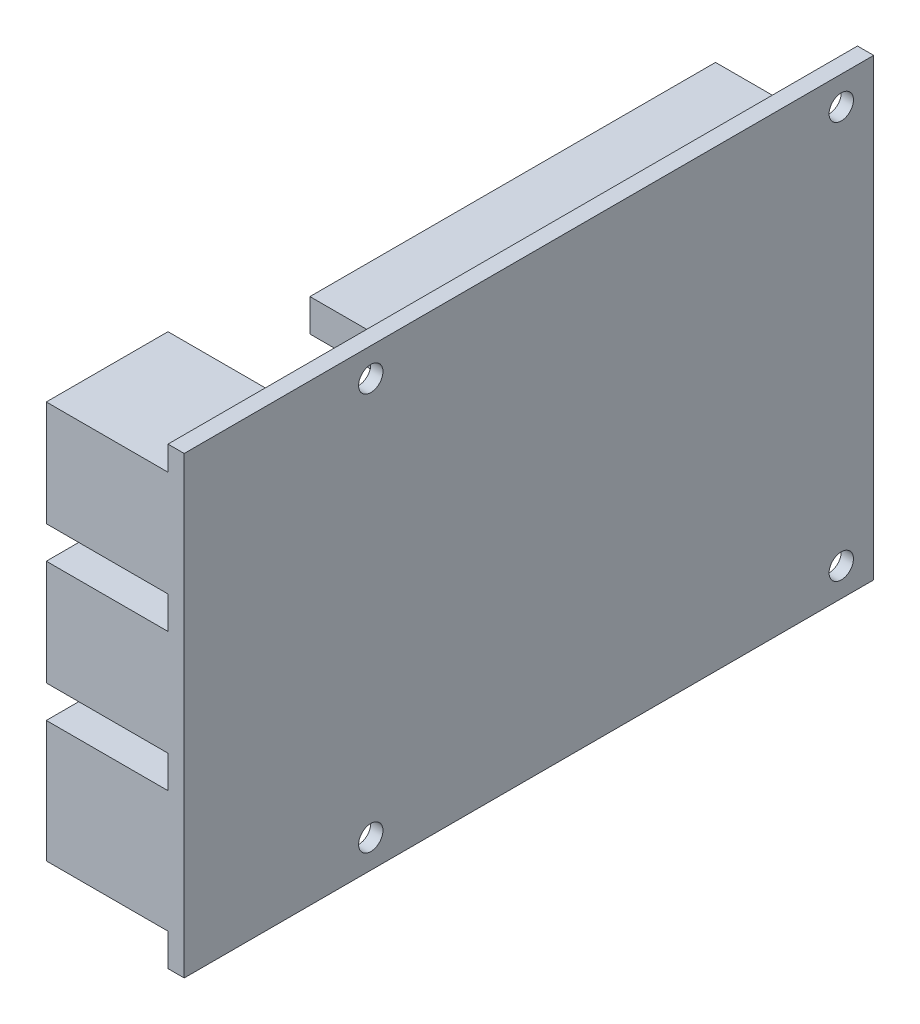
ISO-10303-21;
HEADER;
FILE_DESCRIPTION(('STEP AP214'),'2;1');
FILE_NAME('part.step','',(''),(''),'','','');
FILE_SCHEMA(('AUTOMOTIVE_DESIGN { 1 0 10303 214 1 1 1 1 }'));
ENDSEC;
DATA;
#1=APPLICATION_CONTEXT('core data for automotive mechanical design processes');
#2=APPLICATION_PROTOCOL_DEFINITION('international standard','automotive_design',2000,#1);
#3=PRODUCT_CONTEXT('',#1,'mechanical');
#4=PRODUCT('Part','Part','',(#3));
#5=PRODUCT_RELATED_PRODUCT_CATEGORY('part','',(#4));
#6=PRODUCT_DEFINITION_FORMATION('','',#4);
#7=PRODUCT_DEFINITION_CONTEXT('part definition',#1,'design');
#8=PRODUCT_DEFINITION('design','',#6,#7);
#9=PRODUCT_DEFINITION_SHAPE('','',#8);
#10=(LENGTH_UNIT() NAMED_UNIT(*) SI_UNIT(.MILLI.,.METRE.));
#11=(NAMED_UNIT(*) PLANE_ANGLE_UNIT() SI_UNIT($,.RADIAN.));
#12=(NAMED_UNIT(*) SI_UNIT($,.STERADIAN.) SOLID_ANGLE_UNIT());
#13=UNCERTAINTY_MEASURE_WITH_UNIT(LENGTH_MEASURE(1.E-05),#10,'distance_accuracy_value','');
#14=(GEOMETRIC_REPRESENTATION_CONTEXT(3) GLOBAL_UNCERTAINTY_ASSIGNED_CONTEXT((#13)) GLOBAL_UNIT_ASSIGNED_CONTEXT((#10,
#11,#12)) REPRESENTATION_CONTEXT('',''));
#15=CARTESIAN_POINT('',(0.,0.,0.));
#16=DIRECTION('',(0.,0.,1.));
#17=DIRECTION('',(1.,0.,0.));
#18=AXIS2_PLACEMENT_3D('',#15,#16,#17);
#19=CARTESIAN_POINT('',(0.,0.,0.));
#20=DIRECTION('',(-1.,0.,0.));
#21=DIRECTION('',(0.,0.,1.));
#22=AXIS2_PLACEMENT_3D('',#19,#20,#21);
#23=PLANE('',#22);
#24=CARTESIAN_POINT('',(0.,-24.5,19.5));
#25=DIRECTION('',(-1.,0.,0.));
#26=DIRECTION('',(0.,0.,-1.));
#27=AXIS2_PLACEMENT_3D('',#24,#25,#26);
#28=CIRCLE('',#27,2.5);
#29=CARTESIAN_POINT('',(0.,-24.5,17.));
#30=VERTEX_POINT('',#29);
#31=EDGE_CURVE('E201',#30,#30,#28,.T.);
#32=ORIENTED_EDGE('',*,*,#31,.F.);
#33=EDGE_LOOP('',(#32));
#34=FACE_BOUND('',#33,.T.);
#35=CARTESIAN_POINT('',(0.,-24.5,-38.5));
#36=DIRECTION('',(-1.,0.,0.));
#37=DIRECTION('',(0.,0.,-1.));
#38=AXIS2_PLACEMENT_3D('',#35,#36,#37);
#39=CIRCLE('',#38,2.5);
#40=CARTESIAN_POINT('',(0.,-24.5,-41.));
#41=VERTEX_POINT('',#40);
#42=EDGE_CURVE('E219',#41,#41,#39,.T.);
#43=ORIENTED_EDGE('',*,*,#42,.F.);
#44=EDGE_LOOP('',(#43));
#45=FACE_BOUND('',#44,.T.);
#46=CARTESIAN_POINT('',(0.,24.5,-38.5));
#47=DIRECTION('',(-1.,0.,0.));
#48=DIRECTION('',(0.,0.,1.));
#49=AXIS2_PLACEMENT_3D('',#46,#47,#48);
#50=CIRCLE('',#49,2.5);
#51=CARTESIAN_POINT('',(0.,24.5,-36.));
#52=VERTEX_POINT('',#51);
#53=EDGE_CURVE('E213',#52,#52,#50,.T.);
#54=ORIENTED_EDGE('',*,*,#53,.F.);
#55=EDGE_LOOP('',(#54));
#56=FACE_BOUND('',#55,.T.);
#57=CARTESIAN_POINT('',(0.,24.5,19.5));
#58=DIRECTION('',(-1.,0.,0.));
#59=DIRECTION('',(0.,0.,1.));
#60=AXIS2_PLACEMENT_3D('',#57,#58,#59);
#61=CIRCLE('',#60,2.5);
#62=CARTESIAN_POINT('',(0.,24.5,22.));
#63=VERTEX_POINT('',#62);
#64=EDGE_CURVE('E212',#63,#63,#61,.T.);
#65=ORIENTED_EDGE('',*,*,#64,.F.);
#66=EDGE_LOOP('',(#65));
#67=FACE_BOUND('',#66,.T.);
#68=DIRECTION('',(0.,1.,0.));
#69=VECTOR('',#68,1.);
#70=CARTESIAN_POINT('',(0.,12.,27.5));
#71=LINE('',#70,#69);
#72=CARTESIAN_POINT('',(0.,12.,27.5));
#73=VERTEX_POINT('',#72);
#74=CARTESIAN_POINT('',(0.,25.,27.5));
#75=VERTEX_POINT('',#74);
#76=EDGE_CURVE('E241',#73,#75,#71,.T.);
#77=ORIENTED_EDGE('',*,*,#76,.T.);
#78=DIRECTION('',(0.,0.,-1.));
#79=VECTOR('',#78,1.);
#80=CARTESIAN_POINT('',(0.,25.,42.5));
#81=LINE('',#80,#79);
#82=CARTESIAN_POINT('',(0.,25.,42.5));
#83=VERTEX_POINT('',#82);
#84=EDGE_CURVE('E245',#83,#75,#81,.T.);
#85=ORIENTED_EDGE('',*,*,#84,.F.);
#86=DIRECTION('',(0.,-1.,0.));
#87=VECTOR('',#86,1.);
#88=CARTESIAN_POINT('',(0.,-28.,42.5));
#89=LINE('',#88,#87);
#90=CARTESIAN_POINT('',(0.,28.,42.5));
#91=VERTEX_POINT('',#90);
#92=EDGE_CURVE('E330',#91,#83,#89,.T.);
#93=ORIENTED_EDGE('',*,*,#92,.F.);
#94=DIRECTION('',(0.,0.,1.));
#95=VECTOR('',#94,1.);
#96=CARTESIAN_POINT('',(0.,28.,42.5));
#97=LINE('',#96,#95);
#98=CARTESIAN_POINT('',(0.,28.,-42.5));
#99=VERTEX_POINT('',#98);
#100=EDGE_CURVE('E327',#99,#91,#97,.T.);
#101=ORIENTED_EDGE('',*,*,#100,.F.);
#102=DIRECTION('',(0.,1.,0.));
#103=VECTOR('',#102,1.);
#104=CARTESIAN_POINT('',(0.,-28.,-42.5));
#105=LINE('',#104,#103);
#106=CARTESIAN_POINT('',(0.,-28.,-42.5));
#107=VERTEX_POINT('',#106);
#108=EDGE_CURVE('E313',#107,#99,#105,.T.);
#109=ORIENTED_EDGE('',*,*,#108,.F.);
#110=DIRECTION('',(0.,0.,-1.));
#111=VECTOR('',#110,1.);
#112=CARTESIAN_POINT('',(0.,-28.,42.5));
#113=LINE('',#112,#111);
#114=CARTESIAN_POINT('',(0.,-28.,42.5));
#115=VERTEX_POINT('',#114);
#116=EDGE_CURVE('E318',#115,#107,#113,.T.);
#117=ORIENTED_EDGE('',*,*,#116,.F.);
#118=CARTESIAN_POINT('',(0.,-24.,42.5));
#119=VERTEX_POINT('',#118);
#120=EDGE_CURVE('E329',#119,#115,#89,.T.);
#121=ORIENTED_EDGE('',*,*,#120,.F.);
#122=DIRECTION('',(0.,0.,-1.));
#123=VECTOR('',#122,1.);
#124=CARTESIAN_POINT('',(0.,-24.,42.5));
#125=LINE('',#124,#123);
#126=CARTESIAN_POINT('',(0.,-24.,22.5));
#127=VERTEX_POINT('',#126);
#128=EDGE_CURVE('E289',#119,#127,#125,.T.);
#129=ORIENTED_EDGE('',*,*,#128,.T.);
#130=DIRECTION('',(0.,1.,0.));
#131=VECTOR('',#130,1.);
#132=CARTESIAN_POINT('',(0.,-24.,22.5));
#133=LINE('',#132,#131);
#134=CARTESIAN_POINT('',(0.,-8.99999999999999,22.5));
#135=VERTEX_POINT('',#134);
#136=EDGE_CURVE('E299',#127,#135,#133,.T.);
#137=ORIENTED_EDGE('',*,*,#136,.T.);
#138=DIRECTION('',(0.,0.,-1.));
#139=VECTOR('',#138,1.);
#140=CARTESIAN_POINT('',(0.,-8.99999999999999,42.5));
#141=LINE('',#140,#139);
#142=CARTESIAN_POINT('',(0.,-8.99999999999999,42.5));
#143=VERTEX_POINT('',#142);
#144=EDGE_CURVE('E277',#143,#135,#141,.T.);
#145=ORIENTED_EDGE('',*,*,#144,.F.);
#146=CARTESIAN_POINT('',(0.,-4.99999999999999,42.5));
#147=VERTEX_POINT('',#146);
#148=EDGE_CURVE('E468',#147,#143,#89,.T.);
#149=ORIENTED_EDGE('',*,*,#148,.F.);
#150=DIRECTION('',(0.,0.,-1.));
#151=VECTOR('',#150,1.);
#152=CARTESIAN_POINT('',(0.,-4.99999999999999,42.5));
#153=LINE('',#152,#151);
#154=CARTESIAN_POINT('',(0.,-4.99999999999999,27.5));
#155=VERTEX_POINT('',#154);
#156=EDGE_CURVE('E267',#147,#155,#153,.T.);
#157=ORIENTED_EDGE('',*,*,#156,.T.);
#158=DIRECTION('',(0.,1.,0.));
#159=VECTOR('',#158,1.);
#160=CARTESIAN_POINT('',(0.,-4.99999999999999,27.5));
#161=LINE('',#160,#159);
#162=CARTESIAN_POINT('',(0.,8.00000000000001,27.5));
#163=VERTEX_POINT('',#162);
#164=EDGE_CURVE('E270',#155,#163,#161,.T.);
#165=ORIENTED_EDGE('',*,*,#164,.T.);
#166=DIRECTION('',(0.,0.,-1.));
#167=VECTOR('',#166,1.);
#168=CARTESIAN_POINT('',(0.,8.00000000000001,42.5));
#169=LINE('',#168,#167);
#170=CARTESIAN_POINT('',(0.,8.00000000000001,42.5));
#171=VERTEX_POINT('',#170);
#172=EDGE_CURVE('E274',#171,#163,#169,.T.);
#173=ORIENTED_EDGE('',*,*,#172,.F.);
#174=CARTESIAN_POINT('',(0.,12.,42.5));
#175=VERTEX_POINT('',#174);
#176=EDGE_CURVE('E333',#175,#171,#89,.T.);
#177=ORIENTED_EDGE('',*,*,#176,.F.);
#178=DIRECTION('',(0.,0.,-1.));
#179=VECTOR('',#178,1.);
#180=CARTESIAN_POINT('',(0.,12.,42.5));
#181=LINE('',#180,#179);
#182=EDGE_CURVE('E62',#175,#73,#181,.T.);
#183=ORIENTED_EDGE('',*,*,#182,.T.);
#184=EDGE_LOOP('',(#77,#85,#93,#101,#109,#117,#121,#129,#137,#145,#149,#157,#165,#173,#177,#183));
#185=FACE_BOUND('',#184,.T.);
#186=DIRECTION('',(0.,0.,-1.));
#187=VECTOR('',#186,1.);
#188=CARTESIAN_POINT('',(0.,26.,16.));
#189=LINE('',#188,#187);
#190=CARTESIAN_POINT('',(0.,26.,16.));
#191=VERTEX_POINT('',#190);
#192=CARTESIAN_POINT('',(0.,26.,-34.));
#193=VERTEX_POINT('',#192);
#194=EDGE_CURVE('E492',#191,#193,#189,.T.);
#195=ORIENTED_EDGE('',*,*,#194,.F.);
#196=DIRECTION('',(0.,1.,0.));
#197=VECTOR('',#196,1.);
#198=CARTESIAN_POINT('',(0.,22.,16.));
#199=LINE('',#198,#197);
#200=CARTESIAN_POINT('',(0.,22.,16.));
#201=VERTEX_POINT('',#200);
#202=EDGE_CURVE('E199',#201,#191,#199,.T.);
#203=ORIENTED_EDGE('',*,*,#202,.F.);
#204=DIRECTION('',(0.,0.,1.));
#205=VECTOR('',#204,1.);
#206=CARTESIAN_POINT('',(0.,22.,16.));
#207=LINE('',#206,#205);
#208=CARTESIAN_POINT('',(0.,22.,-34.));
#209=VERTEX_POINT('',#208);
#210=EDGE_CURVE('E195',#209,#201,#207,.T.);
#211=ORIENTED_EDGE('',*,*,#210,.F.);
#212=DIRECTION('',(0.,-1.,0.));
#213=VECTOR('',#212,1.);
#214=CARTESIAN_POINT('',(0.,22.,-34.));
#215=LINE('',#214,#213);
#216=EDGE_CURVE('E494',#193,#209,#215,.T.);
#217=ORIENTED_EDGE('',*,*,#216,.F.);
#218=EDGE_LOOP('',(#195,#203,#211,#217));
#219=FACE_BOUND('',#218,.T.);
#220=ADVANCED_FACE('F37',(#34,#45,#56,#67,#185,#219),#23,.T.);
#221=CARTESIAN_POINT('',(15.,24.5,-38.5));
#222=DIRECTION('',(-1.,0.,0.));
#223=DIRECTION('',(0.,0.,1.));
#224=AXIS2_PLACEMENT_3D('',#221,#222,#223);
#225=CYLINDRICAL_SURFACE('',#224,1.5);
#226=CARTESIAN_POINT('',(2.,24.5,-38.5));
#227=DIRECTION('',(-1.,0.,0.));
#228=DIRECTION('',(0.,0.,1.));
#229=AXIS2_PLACEMENT_3D('',#226,#227,#228);
#230=CIRCLE('',#229,1.5);
#231=CARTESIAN_POINT('',(2.,24.5,-37.));
#232=VERTEX_POINT('',#231);
#233=EDGE_CURVE('E342',#232,#232,#230,.T.);
#234=ORIENTED_EDGE('',*,*,#233,.F.);
#235=EDGE_LOOP('',(#234));
#236=FACE_BOUND('',#235,.T.);
#237=CARTESIAN_POINT('',(0.5,24.5,-38.5));
#238=DIRECTION('',(-1.,0.,0.));
#239=DIRECTION('',(0.,0.,1.));
#240=AXIS2_PLACEMENT_3D('',#237,#238,#239);
#241=CIRCLE('',#240,1.5);
#242=CARTESIAN_POINT('',(0.5,24.5,-37.));
#243=VERTEX_POINT('',#242);
#244=EDGE_CURVE('E41',#243,#243,#241,.F.);
#245=ORIENTED_EDGE('',*,*,#244,.F.);
#246=EDGE_LOOP('',(#245));
#247=FACE_BOUND('',#246,.T.);
#248=ADVANCED_FACE('F366',(#236,#247),#225,.F.);
#249=CARTESIAN_POINT('',(15.,24.5,19.5));
#250=DIRECTION('',(-1.,0.,0.));
#251=DIRECTION('',(0.,0.,1.));
#252=AXIS2_PLACEMENT_3D('',#249,#250,#251);
#253=CYLINDRICAL_SURFACE('',#252,1.5);
#254=CARTESIAN_POINT('',(2.,24.5,19.5));
#255=DIRECTION('',(-1.,0.,0.));
#256=DIRECTION('',(0.,0.,1.));
#257=AXIS2_PLACEMENT_3D('',#254,#255,#256);
#258=CIRCLE('',#257,1.5);
#259=CARTESIAN_POINT('',(2.,24.5,21.));
#260=VERTEX_POINT('',#259);
#261=EDGE_CURVE('E233',#260,#260,#258,.T.);
#262=ORIENTED_EDGE('',*,*,#261,.F.);
#263=EDGE_LOOP('',(#262));
#264=FACE_BOUND('',#263,.T.);
#265=CARTESIAN_POINT('',(0.5,24.5,19.5));
#266=DIRECTION('',(-1.,0.,0.));
#267=DIRECTION('',(0.,0.,1.));
#268=AXIS2_PLACEMENT_3D('',#265,#266,#267);
#269=CIRCLE('',#268,1.5);
#270=CARTESIAN_POINT('',(0.5,24.5,21.));
#271=VERTEX_POINT('',#270);
#272=EDGE_CURVE('E227',#271,#271,#269,.F.);
#273=ORIENTED_EDGE('',*,*,#272,.F.);
#274=EDGE_LOOP('',(#273));
#275=FACE_BOUND('',#274,.T.);
#276=ADVANCED_FACE('F368',(#264,#275),#253,.F.);
#277=CARTESIAN_POINT('',(2.,-28.,-42.5));
#278=DIRECTION('',(0.,0.,1.));
#279=DIRECTION('',(1.,0.,0.));
#280=AXIS2_PLACEMENT_3D('',#277,#278,#279);
#281=PLANE('',#280);
#282=ORIENTED_EDGE('',*,*,#108,.T.);
#283=DIRECTION('',(-1.,0.,0.));
#284=VECTOR('',#283,1.);
#285=CARTESIAN_POINT('',(2.,28.,-42.5));
#286=LINE('',#285,#284);
#287=CARTESIAN_POINT('',(2.,28.,-42.5));
#288=VERTEX_POINT('',#287);
#289=EDGE_CURVE('E11',#288,#99,#286,.T.);
#290=ORIENTED_EDGE('',*,*,#289,.F.);
#291=DIRECTION('',(0.,1.,0.));
#292=VECTOR('',#291,1.);
#293=CARTESIAN_POINT('',(2.,-28.,-42.5));
#294=LINE('',#293,#292);
#295=CARTESIAN_POINT('',(2.,-28.,-42.5));
#296=VERTEX_POINT('',#295);
#297=EDGE_CURVE('E314',#296,#288,#294,.T.);
#298=ORIENTED_EDGE('',*,*,#297,.F.);
#299=DIRECTION('',(-1.,0.,0.));
#300=VECTOR('',#299,1.);
#301=CARTESIAN_POINT('',(2.,-28.,-42.5));
#302=LINE('',#301,#300);
#303=EDGE_CURVE('E324',#296,#107,#302,.T.);
#304=ORIENTED_EDGE('',*,*,#303,.T.);
#305=EDGE_LOOP('',(#282,#290,#298,#304));
#306=FACE_BOUND('',#305,.T.);
#307=ADVANCED_FACE('F39',(#306),#281,.F.);
#308=CARTESIAN_POINT('',(2.,28.,42.5));
#309=DIRECTION('',(0.,-1.,0.));
#310=DIRECTION('',(0.,0.,-1.));
#311=AXIS2_PLACEMENT_3D('',#308,#309,#310);
#312=PLANE('',#311);
#313=ORIENTED_EDGE('',*,*,#100,.T.);
#314=DIRECTION('',(-1.,0.,0.));
#315=VECTOR('',#314,1.);
#316=CARTESIAN_POINT('',(2.,28.,42.5));
#317=LINE('',#316,#315);
#318=CARTESIAN_POINT('',(2.,28.,42.5));
#319=VERTEX_POINT('',#318);
#320=EDGE_CURVE('E46',#319,#91,#317,.T.);
#321=ORIENTED_EDGE('',*,*,#320,.F.);
#322=DIRECTION('',(0.,0.,1.));
#323=VECTOR('',#322,1.);
#324=CARTESIAN_POINT('',(2.,28.,42.5));
#325=LINE('',#324,#323);
#326=EDGE_CURVE('E317',#288,#319,#325,.T.);
#327=ORIENTED_EDGE('',*,*,#326,.F.);
#328=ORIENTED_EDGE('',*,*,#289,.T.);
#329=EDGE_LOOP('',(#313,#321,#327,#328));
#330=FACE_BOUND('',#329,.T.);
#331=ADVANCED_FACE('F441',(#330),#312,.F.);
#332=CARTESIAN_POINT('',(2.,-28.,42.5));
#333=DIRECTION('',(0.,0.,-1.));
#334=DIRECTION('',(-1.,0.,0.));
#335=AXIS2_PLACEMENT_3D('',#332,#333,#334);
#336=PLANE('',#335);
#337=ORIENTED_EDGE('',*,*,#92,.T.);
#338=DIRECTION('',(1.,0.,0.));
#339=VECTOR('',#338,1.);
#340=CARTESIAN_POINT('',(-15.,25.,42.5));
#341=LINE('',#340,#339);
#342=CARTESIAN_POINT('',(-15.,25.,42.5));
#343=VERTEX_POINT('',#342);
#344=EDGE_CURVE('E237',#343,#83,#341,.T.);
#345=ORIENTED_EDGE('',*,*,#344,.F.);
#346=DIRECTION('',(0.,1.,0.));
#347=VECTOR('',#346,1.);
#348=CARTESIAN_POINT('',(-15.,12.,42.5));
#349=LINE('',#348,#347);
#350=CARTESIAN_POINT('',(-15.,12.,42.5));
#351=VERTEX_POINT('',#350);
#352=EDGE_CURVE('E239',#351,#343,#349,.T.);
#353=ORIENTED_EDGE('',*,*,#352,.F.);
#354=DIRECTION('',(1.,0.,0.));
#355=VECTOR('',#354,1.);
#356=CARTESIAN_POINT('',(-15.,12.,42.5));
#357=LINE('',#356,#355);
#358=EDGE_CURVE('E235',#351,#175,#357,.T.);
#359=ORIENTED_EDGE('',*,*,#358,.T.);
#360=ORIENTED_EDGE('',*,*,#176,.T.);
#361=DIRECTION('',(1.,0.,0.));
#362=VECTOR('',#361,1.);
#363=CARTESIAN_POINT('',(-15.,8.00000000000001,42.5));
#364=LINE('',#363,#362);
#365=CARTESIAN_POINT('',(-15.,8.00000000000001,42.5));
#366=VERTEX_POINT('',#365);
#367=EDGE_CURVE('E263',#366,#171,#364,.T.);
#368=ORIENTED_EDGE('',*,*,#367,.F.);
#369=DIRECTION('',(0.,1.,0.));
#370=VECTOR('',#369,1.);
#371=CARTESIAN_POINT('',(-15.,-4.99999999999999,42.5));
#372=LINE('',#371,#370);
#373=CARTESIAN_POINT('',(-15.,-4.99999999999999,42.5));
#374=VERTEX_POINT('',#373);
#375=EDGE_CURVE('E266',#374,#366,#372,.T.);
#376=ORIENTED_EDGE('',*,*,#375,.F.);
#377=DIRECTION('',(1.,0.,0.));
#378=VECTOR('',#377,1.);
#379=CARTESIAN_POINT('',(-15.,-4.99999999999999,42.5));
#380=LINE('',#379,#378);
#381=EDGE_CURVE('E260',#374,#147,#380,.T.);
#382=ORIENTED_EDGE('',*,*,#381,.T.);
#383=ORIENTED_EDGE('',*,*,#148,.T.);
#384=DIRECTION('',(1.,0.,0.));
#385=VECTOR('',#384,1.);
#386=CARTESIAN_POINT('',(-15.,-8.99999999999999,42.5));
#387=LINE('',#386,#385);
#388=CARTESIAN_POINT('',(-15.,-8.99999999999999,42.5));
#389=VERTEX_POINT('',#388);
#390=EDGE_CURVE('E297',#389,#143,#387,.T.);
#391=ORIENTED_EDGE('',*,*,#390,.F.);
#392=DIRECTION('',(0.,1.,0.));
#393=VECTOR('',#392,1.);
#394=CARTESIAN_POINT('',(-15.,-24.,42.5));
#395=LINE('',#394,#393);
#396=CARTESIAN_POINT('',(-15.,-24.,42.5));
#397=VERTEX_POINT('',#396);
#398=EDGE_CURVE('E295',#397,#389,#395,.T.);
#399=ORIENTED_EDGE('',*,*,#398,.F.);
#400=DIRECTION('',(1.,0.,0.));
#401=VECTOR('',#400,1.);
#402=CARTESIAN_POINT('',(-15.,-24.,42.5));
#403=LINE('',#402,#401);
#404=EDGE_CURVE('E306',#397,#119,#403,.T.);
#405=ORIENTED_EDGE('',*,*,#404,.T.);
#406=ORIENTED_EDGE('',*,*,#120,.T.);
#407=DIRECTION('',(-1.,0.,0.));
#408=VECTOR('',#407,1.);
#409=CARTESIAN_POINT('',(2.,-28.,42.5));
#410=LINE('',#409,#408);
#411=CARTESIAN_POINT('',(2.,-28.,42.5));
#412=VERTEX_POINT('',#411);
#413=EDGE_CURVE('E337',#412,#115,#410,.T.);
#414=ORIENTED_EDGE('',*,*,#413,.F.);
#415=DIRECTION('',(0.,-1.,0.));
#416=VECTOR('',#415,1.);
#417=CARTESIAN_POINT('',(2.,-28.,42.5));
#418=LINE('',#417,#416);
#419=EDGE_CURVE('E320',#319,#412,#418,.T.);
#420=ORIENTED_EDGE('',*,*,#419,.F.);
#421=ORIENTED_EDGE('',*,*,#320,.T.);
#422=EDGE_LOOP('',(#337,#345,#353,#359,#360,#368,#376,#382,#383,#391,#399,#405,#406,#414,#420,#421));
#423=FACE_BOUND('',#422,.T.);
#424=ADVANCED_FACE('F438',(#423),#336,.F.);
#425=CARTESIAN_POINT('',(2.,-28.,42.5));
#426=DIRECTION('',(0.,1.,0.));
#427=DIRECTION('',(0.,0.,1.));
#428=AXIS2_PLACEMENT_3D('',#425,#426,#427);
#429=PLANE('',#428);
#430=ORIENTED_EDGE('',*,*,#116,.T.);
#431=ORIENTED_EDGE('',*,*,#303,.F.);
#432=DIRECTION('',(0.,0.,-1.));
#433=VECTOR('',#432,1.);
#434=CARTESIAN_POINT('',(2.,-28.,42.5));
#435=LINE('',#434,#433);
#436=EDGE_CURVE('E322',#412,#296,#435,.T.);
#437=ORIENTED_EDGE('',*,*,#436,.F.);
#438=ORIENTED_EDGE('',*,*,#413,.T.);
#439=EDGE_LOOP('',(#430,#431,#437,#438));
#440=FACE_BOUND('',#439,.T.);
#441=ADVANCED_FACE('F433',(#440),#429,.F.);
#442=CARTESIAN_POINT('',(2.,0.,0.));
#443=DIRECTION('',(-1.,0.,0.));
#444=DIRECTION('',(0.,0.,1.));
#445=AXIS2_PLACEMENT_3D('',#442,#443,#444);
#446=PLANE('',#445);
#447=ORIENTED_EDGE('',*,*,#261,.T.);
#448=EDGE_LOOP('',(#447));
#449=FACE_BOUND('',#448,.T.);
#450=CARTESIAN_POINT('',(2.,-24.5,-38.5));
#451=DIRECTION('',(-1.,0.,0.));
#452=DIRECTION('',(0.,0.,1.));
#453=AXIS2_PLACEMENT_3D('',#450,#451,#452);
#454=CIRCLE('',#453,1.5);
#455=CARTESIAN_POINT('',(2.,-24.5,-37.));
#456=VERTEX_POINT('',#455);
#457=EDGE_CURVE('E348',#456,#456,#454,.T.);
#458=ORIENTED_EDGE('',*,*,#457,.T.);
#459=EDGE_LOOP('',(#458));
#460=FACE_BOUND('',#459,.T.);
#461=CARTESIAN_POINT('',(2.,-24.5,19.5));
#462=DIRECTION('',(-1.,0.,0.));
#463=DIRECTION('',(0.,0.,1.));
#464=AXIS2_PLACEMENT_3D('',#461,#462,#463);
#465=CIRCLE('',#464,1.5);
#466=CARTESIAN_POINT('',(2.,-24.5,21.));
#467=VERTEX_POINT('',#466);
#468=EDGE_CURVE('E345',#467,#467,#465,.T.);
#469=ORIENTED_EDGE('',*,*,#468,.T.);
#470=EDGE_LOOP('',(#469));
#471=FACE_BOUND('',#470,.T.);
#472=ORIENTED_EDGE('',*,*,#233,.T.);
#473=EDGE_LOOP('',(#472));
#474=FACE_BOUND('',#473,.T.);
#475=ORIENTED_EDGE('',*,*,#297,.T.);
#476=ORIENTED_EDGE('',*,*,#326,.T.);
#477=ORIENTED_EDGE('',*,*,#419,.T.);
#478=ORIENTED_EDGE('',*,*,#436,.T.);
#479=EDGE_LOOP('',(#475,#476,#477,#478));
#480=FACE_BOUND('',#479,.T.);
#481=ADVANCED_FACE('F430',(#449,#460,#471,#474,#480),#446,.F.);
#482=CARTESIAN_POINT('',(-15.,-8.99999999999999,42.5));
#483=DIRECTION('',(0.,-1.,0.));
#484=DIRECTION('',(0.,0.,-1.));
#485=AXIS2_PLACEMENT_3D('',#482,#483,#484);
#486=PLANE('',#485);
#487=ORIENTED_EDGE('',*,*,#144,.T.);
#488=DIRECTION('',(1.,0.,0.));
#489=VECTOR('',#488,1.);
#490=CARTESIAN_POINT('',(-15.,-8.99999999999999,22.5));
#491=LINE('',#490,#489);
#492=CARTESIAN_POINT('',(-15.,-8.99999999999999,22.5));
#493=VERTEX_POINT('',#492);
#494=EDGE_CURVE('E310',#493,#135,#491,.T.);
#495=ORIENTED_EDGE('',*,*,#494,.F.);
#496=DIRECTION('',(0.,0.,-1.));
#497=VECTOR('',#496,1.);
#498=CARTESIAN_POINT('',(-15.,-8.99999999999999,42.5));
#499=LINE('',#498,#497);
#500=EDGE_CURVE('E286',#389,#493,#499,.T.);
#501=ORIENTED_EDGE('',*,*,#500,.F.);
#502=ORIENTED_EDGE('',*,*,#390,.T.);
#503=EDGE_LOOP('',(#487,#495,#501,#502));
#504=FACE_BOUND('',#503,.T.);
#505=ADVANCED_FACE('F426',(#504),#486,.F.);
#506=CARTESIAN_POINT('',(-15.,-24.,22.5));
#507=DIRECTION('',(0.,0.,-1.));
#508=DIRECTION('',(-1.,0.,0.));
#509=AXIS2_PLACEMENT_3D('',#506,#507,#508);
#510=PLANE('',#509);
#511=ORIENTED_EDGE('',*,*,#136,.F.);
#512=DIRECTION('',(1.,0.,0.));
#513=VECTOR('',#512,1.);
#514=CARTESIAN_POINT('',(-15.,-24.,22.5));
#515=LINE('',#514,#513);
#516=CARTESIAN_POINT('',(-15.,-24.,22.5));
#517=VERTEX_POINT('',#516);
#518=EDGE_CURVE('E308',#517,#127,#515,.T.);
#519=ORIENTED_EDGE('',*,*,#518,.F.);
#520=DIRECTION('',(0.,1.,0.));
#521=VECTOR('',#520,1.);
#522=CARTESIAN_POINT('',(-15.,-24.,22.5));
#523=LINE('',#522,#521);
#524=EDGE_CURVE('E288',#517,#493,#523,.T.);
#525=ORIENTED_EDGE('',*,*,#524,.T.);
#526=ORIENTED_EDGE('',*,*,#494,.T.);
#527=EDGE_LOOP('',(#511,#519,#525,#526));
#528=FACE_BOUND('',#527,.T.);
#529=ADVANCED_FACE('F422',(#528),#510,.T.);
#530=CARTESIAN_POINT('',(-15.,-24.,42.5));
#531=DIRECTION('',(0.,-1.,0.));
#532=DIRECTION('',(0.,0.,-1.));
#533=AXIS2_PLACEMENT_3D('',#530,#531,#532);
#534=PLANE('',#533);
#535=ORIENTED_EDGE('',*,*,#128,.F.);
#536=ORIENTED_EDGE('',*,*,#404,.F.);
#537=DIRECTION('',(0.,0.,-1.));
#538=VECTOR('',#537,1.);
#539=CARTESIAN_POINT('',(-15.,-24.,42.5));
#540=LINE('',#539,#538);
#541=EDGE_CURVE('E292',#397,#517,#540,.T.);
#542=ORIENTED_EDGE('',*,*,#541,.T.);
#543=ORIENTED_EDGE('',*,*,#518,.T.);
#544=EDGE_LOOP('',(#535,#536,#542,#543));
#545=FACE_BOUND('',#544,.T.);
#546=ADVANCED_FACE('F418',(#545),#534,.T.);
#547=CARTESIAN_POINT('',(-15.,0.,0.));
#548=DIRECTION('',(1.,0.,0.));
#549=DIRECTION('',(0.,0.,-1.));
#550=AXIS2_PLACEMENT_3D('',#547,#548,#549);
#551=PLANE('',#550);
#552=ORIENTED_EDGE('',*,*,#500,.T.);
#553=ORIENTED_EDGE('',*,*,#524,.F.);
#554=ORIENTED_EDGE('',*,*,#541,.F.);
#555=ORIENTED_EDGE('',*,*,#398,.T.);
#556=EDGE_LOOP('',(#552,#553,#554,#555));
#557=FACE_BOUND('',#556,.T.);
#558=ADVANCED_FACE('F404',(#557),#551,.F.);
#559=CARTESIAN_POINT('',(-15.,8.00000000000001,42.5));
#560=DIRECTION('',(0.,-1.,0.));
#561=DIRECTION('',(0.,0.,-1.));
#562=AXIS2_PLACEMENT_3D('',#559,#560,#561);
#563=PLANE('',#562);
#564=ORIENTED_EDGE('',*,*,#172,.T.);
#565=DIRECTION('',(1.,0.,0.));
#566=VECTOR('',#565,1.);
#567=CARTESIAN_POINT('',(-15.,8.00000000000001,27.5));
#568=LINE('',#567,#566);
#569=CARTESIAN_POINT('',(-15.,8.00000000000001,27.5));
#570=VERTEX_POINT('',#569);
#571=EDGE_CURVE('E248',#570,#163,#568,.T.);
#572=ORIENTED_EDGE('',*,*,#571,.F.);
#573=DIRECTION('',(0.,0.,-1.));
#574=VECTOR('',#573,1.);
#575=CARTESIAN_POINT('',(-15.,8.00000000000001,42.5));
#576=LINE('',#575,#574);
#577=EDGE_CURVE('E271',#366,#570,#576,.T.);
#578=ORIENTED_EDGE('',*,*,#577,.F.);
#579=ORIENTED_EDGE('',*,*,#367,.T.);
#580=EDGE_LOOP('',(#564,#572,#578,#579));
#581=FACE_BOUND('',#580,.T.);
#582=ADVANCED_FACE('F400',(#581),#563,.F.);
#583=CARTESIAN_POINT('',(-15.,-4.99999999999999,27.5));
#584=DIRECTION('',(0.,0.,-1.));
#585=DIRECTION('',(0.,1.,0.));
#586=AXIS2_PLACEMENT_3D('',#583,#584,#585);
#587=PLANE('',#586);
#588=ORIENTED_EDGE('',*,*,#164,.F.);
#589=DIRECTION('',(1.,0.,0.));
#590=VECTOR('',#589,1.);
#591=CARTESIAN_POINT('',(-15.,-4.99999999999999,27.5));
#592=LINE('',#591,#590);
#593=CARTESIAN_POINT('',(-15.,-4.99999999999999,27.5));
#594=VERTEX_POINT('',#593);
#595=EDGE_CURVE('E258',#594,#155,#592,.T.);
#596=ORIENTED_EDGE('',*,*,#595,.F.);
#597=DIRECTION('',(0.,1.,0.));
#598=VECTOR('',#597,1.);
#599=CARTESIAN_POINT('',(-15.,-4.99999999999999,27.5));
#600=LINE('',#599,#598);
#601=EDGE_CURVE('E282',#594,#570,#600,.T.);
#602=ORIENTED_EDGE('',*,*,#601,.T.);
#603=ORIENTED_EDGE('',*,*,#571,.T.);
#604=EDGE_LOOP('',(#588,#596,#602,#603));
#605=FACE_BOUND('',#604,.T.);
#606=ADVANCED_FACE('F403',(#605),#587,.T.);
#607=CARTESIAN_POINT('',(-15.,-4.99999999999999,42.5));
#608=DIRECTION('',(0.,-1.,0.));
#609=DIRECTION('',(0.,0.,-1.));
#610=AXIS2_PLACEMENT_3D('',#607,#608,#609);
#611=PLANE('',#610);
#612=ORIENTED_EDGE('',*,*,#156,.F.);
#613=ORIENTED_EDGE('',*,*,#381,.F.);
#614=DIRECTION('',(0.,0.,-1.));
#615=VECTOR('',#614,1.);
#616=CARTESIAN_POINT('',(-15.,-4.99999999999999,42.5));
#617=LINE('',#616,#615);
#618=EDGE_CURVE('E279',#374,#594,#617,.T.);
#619=ORIENTED_EDGE('',*,*,#618,.T.);
#620=ORIENTED_EDGE('',*,*,#595,.T.);
#621=EDGE_LOOP('',(#612,#613,#619,#620));
#622=FACE_BOUND('',#621,.T.);
#623=ADVANCED_FACE('F408',(#622),#611,.T.);
#624=CARTESIAN_POINT('',(-15.,0.,0.));
#625=DIRECTION('',(1.,0.,0.));
#626=DIRECTION('',(0.,0.,-1.));
#627=AXIS2_PLACEMENT_3D('',#624,#625,#626);
#628=PLANE('',#627);
#629=ORIENTED_EDGE('',*,*,#577,.T.);
#630=ORIENTED_EDGE('',*,*,#601,.F.);
#631=ORIENTED_EDGE('',*,*,#618,.F.);
#632=ORIENTED_EDGE('',*,*,#375,.T.);
#633=EDGE_LOOP('',(#629,#630,#631,#632));
#634=FACE_BOUND('',#633,.T.);
#635=ADVANCED_FACE('F387',(#634),#628,.F.);
#636=CARTESIAN_POINT('',(-15.,25.,42.5));
#637=DIRECTION('',(0.,-1.,0.));
#638=DIRECTION('',(0.,0.,-1.));
#639=AXIS2_PLACEMENT_3D('',#636,#637,#638);
#640=PLANE('',#639);
#641=ORIENTED_EDGE('',*,*,#84,.T.);
#642=DIRECTION('',(1.,0.,0.));
#643=VECTOR('',#642,1.);
#644=CARTESIAN_POINT('',(-15.,25.,27.5));
#645=LINE('',#644,#643);
#646=CARTESIAN_POINT('',(-15.,25.,27.5));
#647=VERTEX_POINT('',#646);
#648=EDGE_CURVE('E230',#647,#75,#645,.T.);
#649=ORIENTED_EDGE('',*,*,#648,.F.);
#650=DIRECTION('',(0.,0.,-1.));
#651=VECTOR('',#650,1.);
#652=CARTESIAN_POINT('',(-15.,25.,42.5));
#653=LINE('',#652,#651);
#654=EDGE_CURVE('E242',#343,#647,#653,.T.);
#655=ORIENTED_EDGE('',*,*,#654,.F.);
#656=ORIENTED_EDGE('',*,*,#344,.T.);
#657=EDGE_LOOP('',(#641,#649,#655,#656));
#658=FACE_BOUND('',#657,.T.);
#659=ADVANCED_FACE('F383',(#658),#640,.F.);
#660=CARTESIAN_POINT('',(-15.,12.,27.5));
#661=DIRECTION('',(0.,0.,-1.));
#662=DIRECTION('',(0.,1.,0.));
#663=AXIS2_PLACEMENT_3D('',#660,#661,#662);
#664=PLANE('',#663);
#665=ORIENTED_EDGE('',*,*,#76,.F.);
#666=DIRECTION('',(1.,0.,0.));
#667=VECTOR('',#666,1.);
#668=CARTESIAN_POINT('',(-15.,12.,27.5));
#669=LINE('',#668,#667);
#670=CARTESIAN_POINT('',(-15.,12.,27.5));
#671=VERTEX_POINT('',#670);
#672=EDGE_CURVE('E232',#671,#73,#669,.T.);
#673=ORIENTED_EDGE('',*,*,#672,.F.);
#674=DIRECTION('',(0.,1.,0.));
#675=VECTOR('',#674,1.);
#676=CARTESIAN_POINT('',(-15.,12.,27.5));
#677=LINE('',#676,#675);
#678=EDGE_CURVE('E253',#671,#647,#677,.T.);
#679=ORIENTED_EDGE('',*,*,#678,.T.);
#680=ORIENTED_EDGE('',*,*,#648,.T.);
#681=EDGE_LOOP('',(#665,#673,#679,#680));
#682=FACE_BOUND('',#681,.T.);
#683=ADVANCED_FACE('F386',(#682),#664,.T.);
#684=CARTESIAN_POINT('',(-15.,12.,42.5));
#685=DIRECTION('',(0.,-1.,0.));
#686=DIRECTION('',(0.,0.,-1.));
#687=AXIS2_PLACEMENT_3D('',#684,#685,#686);
#688=PLANE('',#687);
#689=ORIENTED_EDGE('',*,*,#182,.F.);
#690=ORIENTED_EDGE('',*,*,#358,.F.);
#691=DIRECTION('',(0.,0.,-1.));
#692=VECTOR('',#691,1.);
#693=CARTESIAN_POINT('',(-15.,12.,42.5));
#694=LINE('',#693,#692);
#695=EDGE_CURVE('E250',#351,#671,#694,.T.);
#696=ORIENTED_EDGE('',*,*,#695,.T.);
#697=ORIENTED_EDGE('',*,*,#672,.T.);
#698=EDGE_LOOP('',(#689,#690,#696,#697));
#699=FACE_BOUND('',#698,.T.);
#700=ADVANCED_FACE('F391',(#699),#688,.T.);
#701=CARTESIAN_POINT('',(-15.,0.,0.));
#702=DIRECTION('',(1.,0.,0.));
#703=DIRECTION('',(0.,0.,-1.));
#704=AXIS2_PLACEMENT_3D('',#701,#702,#703);
#705=PLANE('',#704);
#706=ORIENTED_EDGE('',*,*,#654,.T.);
#707=ORIENTED_EDGE('',*,*,#678,.F.);
#708=ORIENTED_EDGE('',*,*,#695,.F.);
#709=ORIENTED_EDGE('',*,*,#352,.T.);
#710=EDGE_LOOP('',(#706,#707,#708,#709));
#711=FACE_BOUND('',#710,.T.);
#712=ADVANCED_FACE('F395',(#711),#705,.F.);
#713=CARTESIAN_POINT('',(15.,-24.5,19.5));
#714=DIRECTION('',(-1.,0.,0.));
#715=DIRECTION('',(0.,0.,1.));
#716=AXIS2_PLACEMENT_3D('',#713,#714,#715);
#717=CYLINDRICAL_SURFACE('',#716,1.5);
#718=CARTESIAN_POINT('',(0.5,-24.5,19.5));
#719=DIRECTION('',(1.,0.,0.));
#720=DIRECTION('',(0.,0.,-1.));
#721=AXIS2_PLACEMENT_3D('',#718,#719,#720);
#722=CIRCLE('',#721,1.5);
#723=CARTESIAN_POINT('',(0.5,-24.5,18.));
#724=VERTEX_POINT('',#723);
#725=EDGE_CURVE('E357',#724,#724,#722,.F.);
#726=ORIENTED_EDGE('',*,*,#725,.T.);
#727=EDGE_LOOP('',(#726));
#728=FACE_BOUND('',#727,.T.);
#729=ORIENTED_EDGE('',*,*,#468,.F.);
#730=EDGE_LOOP('',(#729));
#731=FACE_BOUND('',#730,.T.);
#732=ADVANCED_FACE('F398',(#728,#731),#717,.F.);
#733=CARTESIAN_POINT('',(15.,-24.5,-38.5));
#734=DIRECTION('',(-1.,0.,0.));
#735=DIRECTION('',(0.,0.,1.));
#736=AXIS2_PLACEMENT_3D('',#733,#734,#735);
#737=CYLINDRICAL_SURFACE('',#736,1.5);
#738=CARTESIAN_POINT('',(0.5,-24.5,-38.5));
#739=DIRECTION('',(1.,0.,0.));
#740=DIRECTION('',(0.,0.,-1.));
#741=AXIS2_PLACEMENT_3D('',#738,#739,#740);
#742=CIRCLE('',#741,1.5);
#743=CARTESIAN_POINT('',(0.5,-24.5,-40.));
#744=VERTEX_POINT('',#743);
#745=EDGE_CURVE('E355',#744,#744,#742,.F.);
#746=ORIENTED_EDGE('',*,*,#745,.T.);
#747=EDGE_LOOP('',(#746));
#748=FACE_BOUND('',#747,.T.);
#749=ORIENTED_EDGE('',*,*,#457,.F.);
#750=EDGE_LOOP('',(#749));
#751=FACE_BOUND('',#750,.T.);
#752=ADVANCED_FACE('F382',(#748,#751),#737,.F.);
#753=CARTESIAN_POINT('',(0.5,24.5,19.5));
#754=DIRECTION('',(-1.,0.,0.));
#755=DIRECTION('',(0.,0.,1.));
#756=AXIS2_PLACEMENT_3D('',#753,#754,#755);
#757=PLANE('',#756);
#758=CARTESIAN_POINT('',(0.5,24.5,19.5));
#759=DIRECTION('',(-1.,0.,0.));
#760=DIRECTION('',(0.,0.,1.));
#761=AXIS2_PLACEMENT_3D('',#758,#759,#760);
#762=CIRCLE('',#761,2.5);
#763=CARTESIAN_POINT('',(0.5,24.5,22.));
#764=VERTEX_POINT('',#763);
#765=EDGE_CURVE('E224',#764,#764,#762,.T.);
#766=ORIENTED_EDGE('',*,*,#765,.T.);
#767=EDGE_LOOP('',(#766));
#768=FACE_BOUND('',#767,.T.);
#769=ORIENTED_EDGE('',*,*,#272,.T.);
#770=EDGE_LOOP('',(#769));
#771=FACE_BOUND('',#770,.T.);
#772=ADVANCED_FACE('F543',(#768,#771),#757,.T.);
#773=CARTESIAN_POINT('',(0.5,24.5,19.5));
#774=DIRECTION('',(-1.,0.,0.));
#775=DIRECTION('',(0.,0.,1.));
#776=AXIS2_PLACEMENT_3D('',#773,#774,#775);
#777=CYLINDRICAL_SURFACE('',#776,2.5);
#778=ORIENTED_EDGE('',*,*,#765,.F.);
#779=EDGE_LOOP('',(#778));
#780=FACE_BOUND('',#779,.T.);
#781=ORIENTED_EDGE('',*,*,#64,.T.);
#782=EDGE_LOOP('',(#781));
#783=FACE_BOUND('',#782,.T.);
#784=ADVANCED_FACE('F531',(#780,#783),#777,.F.);
#785=CARTESIAN_POINT('',(0.5,-24.5,-38.5));
#786=DIRECTION('',(1.,0.,0.));
#787=DIRECTION('',(0.,0.,-1.));
#788=AXIS2_PLACEMENT_3D('',#785,#786,#787);
#789=PLANE('',#788);
#790=CARTESIAN_POINT('',(0.5,-24.5,-38.5));
#791=DIRECTION('',(-1.,0.,0.));
#792=DIRECTION('',(0.,0.,-1.));
#793=AXIS2_PLACEMENT_3D('',#790,#791,#792);
#794=CIRCLE('',#793,2.5);
#795=CARTESIAN_POINT('',(0.5,-24.5,-41.));
#796=VERTEX_POINT('',#795);
#797=EDGE_CURVE('E216',#796,#796,#794,.T.);
#798=ORIENTED_EDGE('',*,*,#797,.T.);
#799=EDGE_LOOP('',(#798));
#800=FACE_BOUND('',#799,.T.);
#801=ORIENTED_EDGE('',*,*,#745,.F.);
#802=EDGE_LOOP('',(#801));
#803=FACE_BOUND('',#802,.T.);
#804=ADVANCED_FACE('F527',(#800,#803),#789,.F.);
#805=CARTESIAN_POINT('',(0.5,-24.5,-38.5));
#806=DIRECTION('',(-1.,0.,0.));
#807=DIRECTION('',(0.,0.,1.));
#808=AXIS2_PLACEMENT_3D('',#805,#806,#807);
#809=CYLINDRICAL_SURFACE('',#808,2.5);
#810=ORIENTED_EDGE('',*,*,#797,.F.);
#811=EDGE_LOOP('',(#810));
#812=FACE_BOUND('',#811,.T.);
#813=ORIENTED_EDGE('',*,*,#42,.T.);
#814=EDGE_LOOP('',(#813));
#815=FACE_BOUND('',#814,.T.);
#816=ADVANCED_FACE('F530',(#812,#815),#809,.F.);
#817=CARTESIAN_POINT('',(0.5,-24.5,19.5));
#818=DIRECTION('',(1.,0.,0.));
#819=DIRECTION('',(0.,0.,-1.));
#820=AXIS2_PLACEMENT_3D('',#817,#818,#819);
#821=PLANE('',#820);
#822=CARTESIAN_POINT('',(0.5,-24.5,19.5));
#823=DIRECTION('',(-1.,0.,0.));
#824=DIRECTION('',(0.,0.,-1.));
#825=AXIS2_PLACEMENT_3D('',#822,#823,#824);
#826=CIRCLE('',#825,2.5);
#827=CARTESIAN_POINT('',(0.5,-24.5,17.));
#828=VERTEX_POINT('',#827);
#829=EDGE_CURVE('E204',#828,#828,#826,.T.);
#830=ORIENTED_EDGE('',*,*,#829,.T.);
#831=EDGE_LOOP('',(#830));
#832=FACE_BOUND('',#831,.T.);
#833=ORIENTED_EDGE('',*,*,#725,.F.);
#834=EDGE_LOOP('',(#833));
#835=FACE_BOUND('',#834,.T.);
#836=ADVANCED_FACE('F535',(#832,#835),#821,.F.);
#837=CARTESIAN_POINT('',(0.5,-24.5,19.5));
#838=DIRECTION('',(-1.,0.,0.));
#839=DIRECTION('',(0.,0.,1.));
#840=AXIS2_PLACEMENT_3D('',#837,#838,#839);
#841=CYLINDRICAL_SURFACE('',#840,2.5);
#842=ORIENTED_EDGE('',*,*,#829,.F.);
#843=EDGE_LOOP('',(#842));
#844=FACE_BOUND('',#843,.T.);
#845=ORIENTED_EDGE('',*,*,#31,.T.);
#846=EDGE_LOOP('',(#845));
#847=FACE_BOUND('',#846,.T.);
#848=ADVANCED_FACE('F522',(#844,#847),#841,.F.);
#849=CARTESIAN_POINT('',(0.5,24.5,-38.5));
#850=DIRECTION('',(-1.,0.,0.));
#851=DIRECTION('',(0.,0.,1.));
#852=AXIS2_PLACEMENT_3D('',#849,#850,#851);
#853=PLANE('',#852);
#854=CARTESIAN_POINT('',(0.5,24.5,-38.5));
#855=DIRECTION('',(-1.,0.,0.));
#856=DIRECTION('',(0.,0.,1.));
#857=AXIS2_PLACEMENT_3D('',#854,#855,#856);
#858=CIRCLE('',#857,2.5);
#859=CARTESIAN_POINT('',(0.5,24.5,-36.));
#860=VERTEX_POINT('',#859);
#861=EDGE_CURVE('E209',#860,#860,#858,.T.);
#862=ORIENTED_EDGE('',*,*,#861,.T.);
#863=EDGE_LOOP('',(#862));
#864=FACE_BOUND('',#863,.T.);
#865=ORIENTED_EDGE('',*,*,#244,.T.);
#866=EDGE_LOOP('',(#865));
#867=FACE_BOUND('',#866,.T.);
#868=ADVANCED_FACE('F364',(#864,#867),#853,.T.);
#869=CARTESIAN_POINT('',(0.5,24.5,-38.5));
#870=DIRECTION('',(-1.,0.,0.));
#871=DIRECTION('',(0.,0.,1.));
#872=AXIS2_PLACEMENT_3D('',#869,#870,#871);
#873=CYLINDRICAL_SURFACE('',#872,2.5);
#874=ORIENTED_EDGE('',*,*,#861,.F.);
#875=EDGE_LOOP('',(#874));
#876=FACE_BOUND('',#875,.T.);
#877=ORIENTED_EDGE('',*,*,#53,.T.);
#878=EDGE_LOOP('',(#877));
#879=FACE_BOUND('',#878,.T.);
#880=ADVANCED_FACE('F519',(#876,#879),#873,.F.);
#881=CARTESIAN_POINT('',(-9.,22.,16.));
#882=DIRECTION('',(0.,0.,-1.));
#883=DIRECTION('',(-1.,0.,0.));
#884=AXIS2_PLACEMENT_3D('',#881,#882,#883);
#885=PLANE('',#884);
#886=ORIENTED_EDGE('',*,*,#202,.T.);
#887=DIRECTION('',(1.,0.,0.));
#888=VECTOR('',#887,1.);
#889=CARTESIAN_POINT('',(-9.,26.,16.));
#890=LINE('',#889,#888);
#891=CARTESIAN_POINT('',(-9.,26.,16.));
#892=VERTEX_POINT('',#891);
#893=EDGE_CURVE('E180',#892,#191,#890,.T.);
#894=ORIENTED_EDGE('',*,*,#893,.F.);
#895=DIRECTION('',(0.,1.,0.));
#896=VECTOR('',#895,1.);
#897=CARTESIAN_POINT('',(-9.,22.,16.));
#898=LINE('',#897,#896);
#899=CARTESIAN_POINT('',(-9.,22.,16.));
#900=VERTEX_POINT('',#899);
#901=EDGE_CURVE('E187',#900,#892,#898,.T.);
#902=ORIENTED_EDGE('',*,*,#901,.F.);
#903=DIRECTION('',(1.,0.,0.));
#904=VECTOR('',#903,1.);
#905=CARTESIAN_POINT('',(-9.,22.,16.));
#906=LINE('',#905,#904);
#907=EDGE_CURVE('E501',#900,#201,#906,.T.);
#908=ORIENTED_EDGE('',*,*,#907,.T.);
#909=EDGE_LOOP('',(#886,#894,#902,#908));
#910=FACE_BOUND('',#909,.T.);
#911=ADVANCED_FACE('F197',(#910),#885,.F.);
#912=CARTESIAN_POINT('',(-9.,26.,16.));
#913=DIRECTION('',(0.,-1.,0.));
#914=DIRECTION('',(0.,0.,-1.));
#915=AXIS2_PLACEMENT_3D('',#912,#913,#914);
#916=PLANE('',#915);
#917=ORIENTED_EDGE('',*,*,#194,.T.);
#918=DIRECTION('',(1.,0.,0.));
#919=VECTOR('',#918,1.);
#920=CARTESIAN_POINT('',(-9.,26.,-34.));
#921=LINE('',#920,#919);
#922=CARTESIAN_POINT('',(-9.,26.,-34.));
#923=VERTEX_POINT('',#922);
#924=EDGE_CURVE('E183',#923,#193,#921,.T.);
#925=ORIENTED_EDGE('',*,*,#924,.F.);
#926=DIRECTION('',(0.,0.,-1.));
#927=VECTOR('',#926,1.);
#928=CARTESIAN_POINT('',(-9.,26.,16.));
#929=LINE('',#928,#927);
#930=EDGE_CURVE('E176',#892,#923,#929,.T.);
#931=ORIENTED_EDGE('',*,*,#930,.F.);
#932=ORIENTED_EDGE('',*,*,#893,.T.);
#933=EDGE_LOOP('',(#917,#925,#931,#932));
#934=FACE_BOUND('',#933,.T.);
#935=ADVANCED_FACE('F178',(#934),#916,.F.);
#936=CARTESIAN_POINT('',(-9.,22.,-34.));
#937=DIRECTION('',(0.,0.,1.));
#938=DIRECTION('',(1.,0.,0.));
#939=AXIS2_PLACEMENT_3D('',#936,#937,#938);
#940=PLANE('',#939);
#941=ORIENTED_EDGE('',*,*,#216,.T.);
#942=DIRECTION('',(1.,0.,0.));
#943=VECTOR('',#942,1.);
#944=CARTESIAN_POINT('',(-9.,22.,-34.));
#945=LINE('',#944,#943);
#946=CARTESIAN_POINT('',(-9.,22.,-34.));
#947=VERTEX_POINT('',#946);
#948=EDGE_CURVE('E54',#947,#209,#945,.T.);
#949=ORIENTED_EDGE('',*,*,#948,.F.);
#950=DIRECTION('',(0.,-1.,0.));
#951=VECTOR('',#950,1.);
#952=CARTESIAN_POINT('',(-9.,22.,-34.));
#953=LINE('',#952,#951);
#954=EDGE_CURVE('E186',#923,#947,#953,.T.);
#955=ORIENTED_EDGE('',*,*,#954,.F.);
#956=ORIENTED_EDGE('',*,*,#924,.T.);
#957=EDGE_LOOP('',(#941,#949,#955,#956));
#958=FACE_BOUND('',#957,.T.);
#959=ADVANCED_FACE('F504',(#958),#940,.F.);
#960=CARTESIAN_POINT('',(-9.,22.,16.));
#961=DIRECTION('',(0.,1.,0.));
#962=DIRECTION('',(0.,0.,1.));
#963=AXIS2_PLACEMENT_3D('',#960,#961,#962);
#964=PLANE('',#963);
#965=ORIENTED_EDGE('',*,*,#210,.T.);
#966=ORIENTED_EDGE('',*,*,#907,.F.);
#967=DIRECTION('',(0.,0.,1.));
#968=VECTOR('',#967,1.);
#969=CARTESIAN_POINT('',(-9.,22.,16.));
#970=LINE('',#969,#968);
#971=EDGE_CURVE('E191',#947,#900,#970,.T.);
#972=ORIENTED_EDGE('',*,*,#971,.F.);
#973=ORIENTED_EDGE('',*,*,#948,.T.);
#974=EDGE_LOOP('',(#965,#966,#972,#973));
#975=FACE_BOUND('',#974,.T.);
#976=ADVANCED_FACE('F505',(#975),#964,.F.);
#977=CARTESIAN_POINT('',(-9.,0.,0.));
#978=DIRECTION('',(-1.,0.,0.));
#979=DIRECTION('',(0.,0.,1.));
#980=AXIS2_PLACEMENT_3D('',#977,#978,#979);
#981=PLANE('',#980);
#982=ORIENTED_EDGE('',*,*,#901,.T.);
#983=ORIENTED_EDGE('',*,*,#930,.T.);
#984=ORIENTED_EDGE('',*,*,#954,.T.);
#985=ORIENTED_EDGE('',*,*,#971,.T.);
#986=EDGE_LOOP('',(#982,#983,#984,#985));
#987=FACE_BOUND('',#986,.T.);
#988=ADVANCED_FACE('F190',(#987),#981,.T.);
#989=CLOSED_SHELL('',(#220,#248,#276,#307,#331,#424,#441,#481,#505,#529,#546,#558,#582,#606,
#623,#635,#659,#683,#700,#712,#732,#752,#772,#784,#804,#816,#836,#848,#868,#880,#911,#935,#959,
#976,#988));
#990=MANIFOLD_SOLID_BREP('B2',#989);
#991=ADVANCED_BREP_SHAPE_REPRESENTATION('',(#18,#990),#14);
#992=SHAPE_DEFINITION_REPRESENTATION(#9,#991);
ENDSEC;
END-ISO-10303-21;
